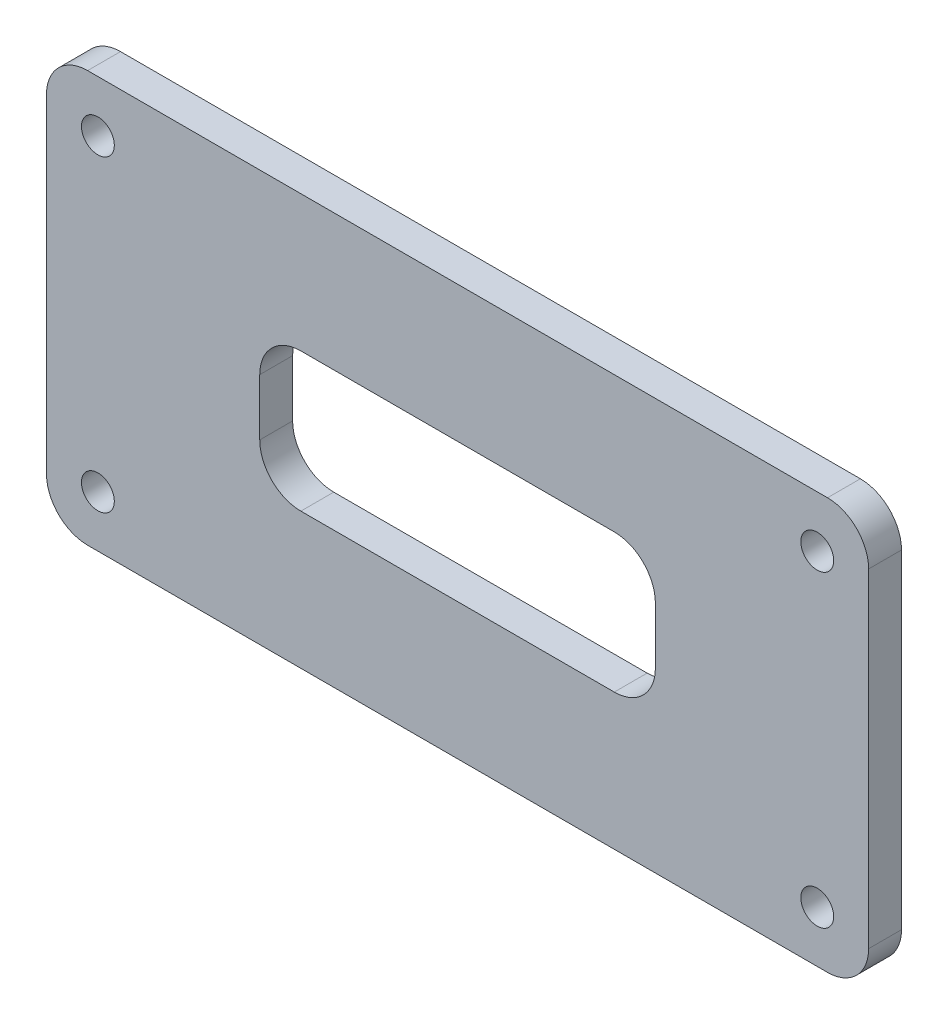
ISO-10303-21;
HEADER;
FILE_DESCRIPTION(('STEP AP214'),'2;1');
FILE_NAME('part.step','',(''),(''),'','','');
FILE_SCHEMA(('AUTOMOTIVE_DESIGN { 1 0 10303 214 1 1 1 1 }'));
ENDSEC;
DATA;
#1=APPLICATION_CONTEXT('core data for automotive mechanical design processes');
#2=APPLICATION_PROTOCOL_DEFINITION('international standard','automotive_design',2000,#1);
#3=PRODUCT_CONTEXT('',#1,'mechanical');
#4=PRODUCT('Part','Part','',(#3));
#5=PRODUCT_RELATED_PRODUCT_CATEGORY('part','',(#4));
#6=PRODUCT_DEFINITION_FORMATION('','',#4);
#7=PRODUCT_DEFINITION_CONTEXT('part definition',#1,'design');
#8=PRODUCT_DEFINITION('design','',#6,#7);
#9=PRODUCT_DEFINITION_SHAPE('','',#8);
#10=(LENGTH_UNIT() NAMED_UNIT(*) SI_UNIT(.MILLI.,.METRE.));
#11=(NAMED_UNIT(*) PLANE_ANGLE_UNIT() SI_UNIT($,.RADIAN.));
#12=(NAMED_UNIT(*) SI_UNIT($,.STERADIAN.) SOLID_ANGLE_UNIT());
#13=UNCERTAINTY_MEASURE_WITH_UNIT(LENGTH_MEASURE(1.E-05),#10,'distance_accuracy_value','');
#14=(GEOMETRIC_REPRESENTATION_CONTEXT(3) GLOBAL_UNCERTAINTY_ASSIGNED_CONTEXT((#13)) GLOBAL_UNIT_ASSIGNED_CONTEXT((#10,
#11,#12)) REPRESENTATION_CONTEXT('',''));
#15=CARTESIAN_POINT('',(0.,0.,0.));
#16=DIRECTION('',(0.,0.,1.));
#17=DIRECTION('',(1.,0.,0.));
#18=AXIS2_PLACEMENT_3D('',#15,#16,#17);
#19=CARTESIAN_POINT('',(-36.,-16.,-3.2));
#20=DIRECTION('',(0.,0.,1.));
#21=DIRECTION('',(1.,0.,0.));
#22=AXIS2_PLACEMENT_3D('',#19,#20,#21);
#23=CYLINDRICAL_SURFACE('',#22,4.);
#24=CARTESIAN_POINT('',(-36.,-16.,0.));
#25=DIRECTION('',(0.,0.,1.));
#26=DIRECTION('',(1.,0.,0.));
#27=AXIS2_PLACEMENT_3D('',#24,#25,#26);
#28=CIRCLE('',#27,4.);
#29=CARTESIAN_POINT('',(-40.,-16.,0.));
#30=VERTEX_POINT('',#29);
#31=CARTESIAN_POINT('',(-36.,-20.,0.));
#32=VERTEX_POINT('',#31);
#33=EDGE_CURVE('E229',#30,#32,#28,.T.);
#34=ORIENTED_EDGE('',*,*,#33,.F.);
#35=DIRECTION('',(0.,0.,1.));
#36=VECTOR('',#35,1.);
#37=CARTESIAN_POINT('',(-40.,-16.,-3.2));
#38=LINE('',#37,#36);
#39=CARTESIAN_POINT('',(-40.,-16.,-3.2));
#40=VERTEX_POINT('',#39);
#41=EDGE_CURVE('E12',#40,#30,#38,.T.);
#42=ORIENTED_EDGE('',*,*,#41,.F.);
#43=CARTESIAN_POINT('',(-36.,-16.,-3.2));
#44=DIRECTION('',(0.,0.,1.));
#45=DIRECTION('',(1.,0.,0.));
#46=AXIS2_PLACEMENT_3D('',#43,#44,#45);
#47=CIRCLE('',#46,4.);
#48=CARTESIAN_POINT('',(-36.,-20.,-3.2));
#49=VERTEX_POINT('',#48);
#50=EDGE_CURVE('E241',#40,#49,#47,.T.);
#51=ORIENTED_EDGE('',*,*,#50,.T.);
#52=DIRECTION('',(0.,0.,1.));
#53=VECTOR('',#52,1.);
#54=CARTESIAN_POINT('',(-36.,-20.,-3.2));
#55=LINE('',#54,#53);
#56=EDGE_CURVE('E50',#49,#32,#55,.T.);
#57=ORIENTED_EDGE('',*,*,#56,.T.);
#58=EDGE_LOOP('',(#34,#42,#51,#57));
#59=FACE_BOUND('',#58,.T.);
#60=ADVANCED_FACE('F47',(#59),#23,.T.);
#61=CARTESIAN_POINT('',(-40.,16.,-3.2));
#62=DIRECTION('',(-1.,0.,0.));
#63=DIRECTION('',(0.,-1.,0.));
#64=AXIS2_PLACEMENT_3D('',#61,#62,#63);
#65=PLANE('',#64);
#66=DIRECTION('',(0.,-1.,0.));
#67=VECTOR('',#66,1.);
#68=CARTESIAN_POINT('',(-40.,16.,0.));
#69=LINE('',#68,#67);
#70=CARTESIAN_POINT('',(-40.,16.,0.));
#71=VERTEX_POINT('',#70);
#72=EDGE_CURVE('E245',#71,#30,#69,.T.);
#73=ORIENTED_EDGE('',*,*,#72,.F.);
#74=DIRECTION('',(0.,0.,1.));
#75=VECTOR('',#74,1.);
#76=CARTESIAN_POINT('',(-40.,16.,-3.2));
#77=LINE('',#76,#75);
#78=CARTESIAN_POINT('',(-40.,16.,-3.2));
#79=VERTEX_POINT('',#78);
#80=EDGE_CURVE('E55',#79,#71,#77,.T.);
#81=ORIENTED_EDGE('',*,*,#80,.F.);
#82=DIRECTION('',(0.,-1.,0.));
#83=VECTOR('',#82,1.);
#84=CARTESIAN_POINT('',(-40.,16.,-3.2));
#85=LINE('',#84,#83);
#86=EDGE_CURVE('E263',#79,#40,#85,.T.);
#87=ORIENTED_EDGE('',*,*,#86,.T.);
#88=ORIENTED_EDGE('',*,*,#41,.T.);
#89=EDGE_LOOP('',(#73,#81,#87,#88));
#90=FACE_BOUND('',#89,.T.);
#91=ADVANCED_FACE('F332',(#90),#65,.T.);
#92=CARTESIAN_POINT('',(-36.,16.,-3.2));
#93=DIRECTION('',(0.,0.,1.));
#94=DIRECTION('',(1.,0.,0.));
#95=AXIS2_PLACEMENT_3D('',#92,#93,#94);
#96=CYLINDRICAL_SURFACE('',#95,4.);
#97=CARTESIAN_POINT('',(-36.,16.,0.));
#98=DIRECTION('',(0.,0.,1.));
#99=DIRECTION('',(1.,0.,0.));
#100=AXIS2_PLACEMENT_3D('',#97,#98,#99);
#101=CIRCLE('',#100,4.);
#102=CARTESIAN_POINT('',(-36.,20.,0.));
#103=VERTEX_POINT('',#102);
#104=EDGE_CURVE('E299',#103,#71,#101,.T.);
#105=ORIENTED_EDGE('',*,*,#104,.F.);
#106=DIRECTION('',(0.,0.,1.));
#107=VECTOR('',#106,1.);
#108=CARTESIAN_POINT('',(-36.,20.,-3.2));
#109=LINE('',#108,#107);
#110=CARTESIAN_POINT('',(-36.,20.,-3.2));
#111=VERTEX_POINT('',#110);
#112=EDGE_CURVE('E308',#111,#103,#109,.T.);
#113=ORIENTED_EDGE('',*,*,#112,.F.);
#114=CARTESIAN_POINT('',(-36.,16.,-3.2));
#115=DIRECTION('',(0.,0.,1.));
#116=DIRECTION('',(1.,0.,0.));
#117=AXIS2_PLACEMENT_3D('',#114,#115,#116);
#118=CIRCLE('',#117,4.);
#119=EDGE_CURVE('E260',#111,#79,#118,.T.);
#120=ORIENTED_EDGE('',*,*,#119,.T.);
#121=ORIENTED_EDGE('',*,*,#80,.T.);
#122=EDGE_LOOP('',(#105,#113,#120,#121));
#123=FACE_BOUND('',#122,.T.);
#124=ADVANCED_FACE('F418',(#123),#96,.T.);
#125=CARTESIAN_POINT('',(-36.,20.,-3.2));
#126=DIRECTION('',(0.,1.,0.));
#127=DIRECTION('',(-1.,0.,0.));
#128=AXIS2_PLACEMENT_3D('',#125,#126,#127);
#129=PLANE('',#128);
#130=DIRECTION('',(-1.,0.,0.));
#131=VECTOR('',#130,1.);
#132=CARTESIAN_POINT('',(-36.,20.,0.));
#133=LINE('',#132,#131);
#134=CARTESIAN_POINT('',(36.,20.,0.));
#135=VERTEX_POINT('',#134);
#136=EDGE_CURVE('E295',#135,#103,#133,.T.);
#137=ORIENTED_EDGE('',*,*,#136,.F.);
#138=DIRECTION('',(0.,0.,1.));
#139=VECTOR('',#138,1.);
#140=CARTESIAN_POINT('',(36.,20.,-3.2));
#141=LINE('',#140,#139);
#142=CARTESIAN_POINT('',(36.,20.,-3.2));
#143=VERTEX_POINT('',#142);
#144=EDGE_CURVE('E310',#143,#135,#141,.T.);
#145=ORIENTED_EDGE('',*,*,#144,.F.);
#146=DIRECTION('',(-1.,0.,0.));
#147=VECTOR('',#146,1.);
#148=CARTESIAN_POINT('',(-36.,20.,-3.2));
#149=LINE('',#148,#147);
#150=EDGE_CURVE('E257',#143,#111,#149,.T.);
#151=ORIENTED_EDGE('',*,*,#150,.T.);
#152=ORIENTED_EDGE('',*,*,#112,.T.);
#153=EDGE_LOOP('',(#137,#145,#151,#152));
#154=FACE_BOUND('',#153,.T.);
#155=ADVANCED_FACE('F349',(#154),#129,.T.);
#156=CARTESIAN_POINT('',(36.,16.,-3.2));
#157=DIRECTION('',(0.,0.,1.));
#158=DIRECTION('',(1.,0.,0.));
#159=AXIS2_PLACEMENT_3D('',#156,#157,#158);
#160=CYLINDRICAL_SURFACE('',#159,4.);
#161=CARTESIAN_POINT('',(36.,16.,0.));
#162=DIRECTION('',(0.,0.,1.));
#163=DIRECTION('',(1.,0.,0.));
#164=AXIS2_PLACEMENT_3D('',#161,#162,#163);
#165=CIRCLE('',#164,4.);
#166=CARTESIAN_POINT('',(40.,16.,0.));
#167=VERTEX_POINT('',#166);
#168=EDGE_CURVE('E290',#167,#135,#165,.T.);
#169=ORIENTED_EDGE('',*,*,#168,.F.);
#170=DIRECTION('',(0.,0.,1.));
#171=VECTOR('',#170,1.);
#172=CARTESIAN_POINT('',(40.,16.,-3.2));
#173=LINE('',#172,#171);
#174=CARTESIAN_POINT('',(40.,16.,-3.2));
#175=VERTEX_POINT('',#174);
#176=EDGE_CURVE('E312',#175,#167,#173,.T.);
#177=ORIENTED_EDGE('',*,*,#176,.F.);
#178=CARTESIAN_POINT('',(36.,16.,-3.2));
#179=DIRECTION('',(0.,0.,1.));
#180=DIRECTION('',(1.,0.,0.));
#181=AXIS2_PLACEMENT_3D('',#178,#179,#180);
#182=CIRCLE('',#181,4.);
#183=EDGE_CURVE('E254',#175,#143,#182,.T.);
#184=ORIENTED_EDGE('',*,*,#183,.T.);
#185=ORIENTED_EDGE('',*,*,#144,.T.);
#186=EDGE_LOOP('',(#169,#177,#184,#185));
#187=FACE_BOUND('',#186,.T.);
#188=ADVANCED_FACE('F345',(#187),#160,.T.);
#189=CARTESIAN_POINT('',(40.,16.,-3.2));
#190=DIRECTION('',(1.,0.,0.));
#191=DIRECTION('',(0.,1.,0.));
#192=AXIS2_PLACEMENT_3D('',#189,#190,#191);
#193=PLANE('',#192);
#194=DIRECTION('',(0.,1.,0.));
#195=VECTOR('',#194,1.);
#196=CARTESIAN_POINT('',(40.,16.,0.));
#197=LINE('',#196,#195);
#198=CARTESIAN_POINT('',(40.,-16.,0.));
#199=VERTEX_POINT('',#198);
#200=EDGE_CURVE('E285',#199,#167,#197,.T.);
#201=ORIENTED_EDGE('',*,*,#200,.F.);
#202=DIRECTION('',(0.,0.,1.));
#203=VECTOR('',#202,1.);
#204=CARTESIAN_POINT('',(40.,-16.,-3.2));
#205=LINE('',#204,#203);
#206=CARTESIAN_POINT('',(40.,-16.,-3.2));
#207=VERTEX_POINT('',#206);
#208=EDGE_CURVE('E314',#207,#199,#205,.T.);
#209=ORIENTED_EDGE('',*,*,#208,.F.);
#210=DIRECTION('',(0.,1.,0.));
#211=VECTOR('',#210,1.);
#212=CARTESIAN_POINT('',(40.,16.,-3.2));
#213=LINE('',#212,#211);
#214=EDGE_CURVE('E251',#207,#175,#213,.T.);
#215=ORIENTED_EDGE('',*,*,#214,.T.);
#216=ORIENTED_EDGE('',*,*,#176,.T.);
#217=EDGE_LOOP('',(#201,#209,#215,#216));
#218=FACE_BOUND('',#217,.T.);
#219=ADVANCED_FACE('F343',(#218),#193,.T.);
#220=CARTESIAN_POINT('',(36.,-16.,-3.2));
#221=DIRECTION('',(0.,0.,1.));
#222=DIRECTION('',(1.,0.,0.));
#223=AXIS2_PLACEMENT_3D('',#220,#221,#222);
#224=CYLINDRICAL_SURFACE('',#223,4.);
#225=CARTESIAN_POINT('',(36.,-16.,0.));
#226=DIRECTION('',(0.,0.,1.));
#227=DIRECTION('',(1.,0.,0.));
#228=AXIS2_PLACEMENT_3D('',#225,#226,#227);
#229=CIRCLE('',#228,4.);
#230=CARTESIAN_POINT('',(36.,-20.,0.));
#231=VERTEX_POINT('',#230);
#232=EDGE_CURVE('E281',#231,#199,#229,.T.);
#233=ORIENTED_EDGE('',*,*,#232,.F.);
#234=DIRECTION('',(0.,0.,1.));
#235=VECTOR('',#234,1.);
#236=CARTESIAN_POINT('',(36.,-20.,-3.2));
#237=LINE('',#236,#235);
#238=CARTESIAN_POINT('',(36.,-20.,-3.2));
#239=VERTEX_POINT('',#238);
#240=EDGE_CURVE('E315',#239,#231,#237,.T.);
#241=ORIENTED_EDGE('',*,*,#240,.F.);
#242=CARTESIAN_POINT('',(36.,-16.,-3.2));
#243=DIRECTION('',(0.,0.,1.));
#244=DIRECTION('',(1.,0.,0.));
#245=AXIS2_PLACEMENT_3D('',#242,#243,#244);
#246=CIRCLE('',#245,4.);
#247=EDGE_CURVE('E248',#239,#207,#246,.T.);
#248=ORIENTED_EDGE('',*,*,#247,.T.);
#249=ORIENTED_EDGE('',*,*,#208,.T.);
#250=EDGE_LOOP('',(#233,#241,#248,#249));
#251=FACE_BOUND('',#250,.T.);
#252=ADVANCED_FACE('F339',(#251),#224,.T.);
#253=CARTESIAN_POINT('',(-36.,-20.,-3.2));
#254=DIRECTION('',(0.,-1.,0.));
#255=DIRECTION('',(0.,0.,-1.));
#256=AXIS2_PLACEMENT_3D('',#253,#254,#255);
#257=PLANE('',#256);
#258=DIRECTION('',(1.,0.,0.));
#259=VECTOR('',#258,1.);
#260=CARTESIAN_POINT('',(-36.,-20.,0.));
#261=LINE('',#260,#259);
#262=EDGE_CURVE('E270',#32,#231,#261,.T.);
#263=ORIENTED_EDGE('',*,*,#262,.F.);
#264=ORIENTED_EDGE('',*,*,#56,.F.);
#265=DIRECTION('',(1.,0.,0.));
#266=VECTOR('',#265,1.);
#267=CARTESIAN_POINT('',(-36.,-20.,-3.2));
#268=LINE('',#267,#266);
#269=EDGE_CURVE('E244',#49,#239,#268,.T.);
#270=ORIENTED_EDGE('',*,*,#269,.T.);
#271=ORIENTED_EDGE('',*,*,#240,.T.);
#272=EDGE_LOOP('',(#263,#264,#270,#271));
#273=FACE_BOUND('',#272,.T.);
#274=ADVANCED_FACE('F324',(#273),#257,.T.);
#275=CARTESIAN_POINT('',(-36.,-16.,-3.2));
#276=DIRECTION('',(0.,0.,1.));
#277=DIRECTION('',(1.,0.,0.));
#278=AXIS2_PLACEMENT_3D('',#275,#276,#277);
#279=PLANE('',#278);
#280=CARTESIAN_POINT('',(-35.,-15.,-3.2));
#281=DIRECTION('',(0.,0.,1.));
#282=DIRECTION('',(1.,0.,0.));
#283=AXIS2_PLACEMENT_3D('',#280,#281,#282);
#284=CIRCLE('',#283,1.6);
#285=CARTESIAN_POINT('',(-33.4,-15.,-3.2));
#286=VERTEX_POINT('',#285);
#287=EDGE_CURVE('E358',#286,#286,#284,.T.);
#288=ORIENTED_EDGE('',*,*,#287,.T.);
#289=EDGE_LOOP('',(#288));
#290=FACE_BOUND('',#289,.T.);
#291=CARTESIAN_POINT('',(35.,-15.,-3.2));
#292=DIRECTION('',(0.,0.,1.));
#293=DIRECTION('',(1.,0.,0.));
#294=AXIS2_PLACEMENT_3D('',#291,#292,#293);
#295=CIRCLE('',#294,1.6);
#296=CARTESIAN_POINT('',(36.6,-15.,-3.2));
#297=VERTEX_POINT('',#296);
#298=EDGE_CURVE('E357',#297,#297,#295,.T.);
#299=ORIENTED_EDGE('',*,*,#298,.T.);
#300=EDGE_LOOP('',(#299));
#301=FACE_BOUND('',#300,.T.);
#302=CARTESIAN_POINT('',(35.,15.,-3.2));
#303=DIRECTION('',(0.,0.,1.));
#304=DIRECTION('',(1.,0.,0.));
#305=AXIS2_PLACEMENT_3D('',#302,#303,#304);
#306=CIRCLE('',#305,1.6);
#307=CARTESIAN_POINT('',(36.6,15.,-3.2));
#308=VERTEX_POINT('',#307);
#309=EDGE_CURVE('E362',#308,#308,#306,.T.);
#310=ORIENTED_EDGE('',*,*,#309,.T.);
#311=EDGE_LOOP('',(#310));
#312=FACE_BOUND('',#311,.T.);
#313=CARTESIAN_POINT('',(-35.,15.,-3.2));
#314=DIRECTION('',(0.,0.,1.));
#315=DIRECTION('',(1.,0.,0.));
#316=AXIS2_PLACEMENT_3D('',#313,#314,#315);
#317=CIRCLE('',#316,1.6);
#318=CARTESIAN_POINT('',(-33.4,15.,-3.2));
#319=VERTEX_POINT('',#318);
#320=EDGE_CURVE('E205',#319,#319,#317,.T.);
#321=ORIENTED_EDGE('',*,*,#320,.T.);
#322=EDGE_LOOP('',(#321));
#323=FACE_BOUND('',#322,.T.);
#324=DIRECTION('',(0.,-1.,0.));
#325=VECTOR('',#324,1.);
#326=CARTESIAN_POINT('',(-19.25,2.75,-3.2));
#327=LINE('',#326,#325);
#328=CARTESIAN_POINT('',(-19.25,2.75,-3.2));
#329=VERTEX_POINT('',#328);
#330=CARTESIAN_POINT('',(-19.25,-2.75,-3.2));
#331=VERTEX_POINT('',#330);
#332=EDGE_CURVE('E168',#329,#331,#327,.T.);
#333=ORIENTED_EDGE('',*,*,#332,.T.);
#334=CARTESIAN_POINT('',(-15.25,-2.75,-3.2));
#335=DIRECTION('',(0.,0.,1.));
#336=DIRECTION('',(1.,0.,0.));
#337=AXIS2_PLACEMENT_3D('',#334,#335,#336);
#338=CIRCLE('',#337,4.);
#339=CARTESIAN_POINT('',(-15.25,-6.75,-3.2));
#340=VERTEX_POINT('',#339);
#341=EDGE_CURVE('E162',#331,#340,#338,.T.);
#342=ORIENTED_EDGE('',*,*,#341,.T.);
#343=DIRECTION('',(1.,0.,0.));
#344=VECTOR('',#343,1.);
#345=CARTESIAN_POINT('',(-15.25,-6.75,-3.2));
#346=LINE('',#345,#344);
#347=CARTESIAN_POINT('',(15.25,-6.75,-3.2));
#348=VERTEX_POINT('',#347);
#349=EDGE_CURVE('E171',#340,#348,#346,.T.);
#350=ORIENTED_EDGE('',*,*,#349,.T.);
#351=CARTESIAN_POINT('',(15.25,-2.75,-3.2));
#352=DIRECTION('',(0.,0.,1.));
#353=DIRECTION('',(1.,0.,0.));
#354=AXIS2_PLACEMENT_3D('',#351,#352,#353);
#355=CIRCLE('',#354,4.);
#356=CARTESIAN_POINT('',(19.25,-2.75,-3.2));
#357=VERTEX_POINT('',#356);
#358=EDGE_CURVE('E63',#348,#357,#355,.T.);
#359=ORIENTED_EDGE('',*,*,#358,.T.);
#360=DIRECTION('',(0.,1.,0.));
#361=VECTOR('',#360,1.);
#362=CARTESIAN_POINT('',(19.25,2.75,-3.2));
#363=LINE('',#362,#361);
#364=CARTESIAN_POINT('',(19.25,2.75,-3.2));
#365=VERTEX_POINT('',#364);
#366=EDGE_CURVE('E190',#357,#365,#363,.T.);
#367=ORIENTED_EDGE('',*,*,#366,.T.);
#368=CARTESIAN_POINT('',(15.25,2.75,-3.2));
#369=DIRECTION('',(0.,0.,1.));
#370=DIRECTION('',(1.,0.,0.));
#371=AXIS2_PLACEMENT_3D('',#368,#369,#370);
#372=CIRCLE('',#371,4.);
#373=CARTESIAN_POINT('',(15.25,6.75,-3.2));
#374=VERTEX_POINT('',#373);
#375=EDGE_CURVE('E193',#365,#374,#372,.T.);
#376=ORIENTED_EDGE('',*,*,#375,.T.);
#377=DIRECTION('',(-1.,0.,0.));
#378=VECTOR('',#377,1.);
#379=CARTESIAN_POINT('',(-15.25,6.75,-3.2));
#380=LINE('',#379,#378);
#381=CARTESIAN_POINT('',(-15.25,6.75,-3.2));
#382=VERTEX_POINT('',#381);
#383=EDGE_CURVE('E196',#374,#382,#380,.T.);
#384=ORIENTED_EDGE('',*,*,#383,.T.);
#385=CARTESIAN_POINT('',(-15.25,2.75,-3.2));
#386=DIRECTION('',(0.,0.,1.));
#387=DIRECTION('',(1.,0.,0.));
#388=AXIS2_PLACEMENT_3D('',#385,#386,#387);
#389=CIRCLE('',#388,4.);
#390=EDGE_CURVE('E199',#382,#329,#389,.T.);
#391=ORIENTED_EDGE('',*,*,#390,.T.);
#392=EDGE_LOOP('',(#333,#342,#350,#359,#367,#376,#384,#391));
#393=FACE_BOUND('',#392,.T.);
#394=ORIENTED_EDGE('',*,*,#50,.F.);
#395=ORIENTED_EDGE('',*,*,#86,.F.);
#396=ORIENTED_EDGE('',*,*,#119,.F.);
#397=ORIENTED_EDGE('',*,*,#150,.F.);
#398=ORIENTED_EDGE('',*,*,#183,.F.);
#399=ORIENTED_EDGE('',*,*,#214,.F.);
#400=ORIENTED_EDGE('',*,*,#247,.F.);
#401=ORIENTED_EDGE('',*,*,#269,.F.);
#402=EDGE_LOOP('',(#394,#395,#396,#397,#398,#399,#400,#401));
#403=FACE_BOUND('',#402,.T.);
#404=ADVANCED_FACE('F175',(#290,#301,#312,#323,#393,#403),#279,.F.);
#405=CARTESIAN_POINT('',(-36.,-16.,0.));
#406=DIRECTION('',(0.,0.,1.));
#407=DIRECTION('',(1.,0.,0.));
#408=AXIS2_PLACEMENT_3D('',#405,#406,#407);
#409=PLANE('',#408);
#410=CARTESIAN_POINT('',(-35.,-15.,0.));
#411=DIRECTION('',(0.,0.,1.));
#412=DIRECTION('',(1.,0.,0.));
#413=AXIS2_PLACEMENT_3D('',#410,#411,#412);
#414=CIRCLE('',#413,1.6);
#415=CARTESIAN_POINT('',(-33.4,-15.,0.));
#416=VERTEX_POINT('',#415);
#417=EDGE_CURVE('E363',#416,#416,#414,.T.);
#418=ORIENTED_EDGE('',*,*,#417,.F.);
#419=EDGE_LOOP('',(#418));
#420=FACE_BOUND('',#419,.T.);
#421=CARTESIAN_POINT('',(35.,-15.,0.));
#422=DIRECTION('',(0.,0.,1.));
#423=DIRECTION('',(1.,0.,0.));
#424=AXIS2_PLACEMENT_3D('',#421,#422,#423);
#425=CIRCLE('',#424,1.6);
#426=CARTESIAN_POINT('',(36.6,-15.,0.));
#427=VERTEX_POINT('',#426);
#428=EDGE_CURVE('E354',#427,#427,#425,.T.);
#429=ORIENTED_EDGE('',*,*,#428,.F.);
#430=EDGE_LOOP('',(#429));
#431=FACE_BOUND('',#430,.T.);
#432=CARTESIAN_POINT('',(35.,15.,0.));
#433=DIRECTION('',(0.,0.,1.));
#434=DIRECTION('',(1.,0.,0.));
#435=AXIS2_PLACEMENT_3D('',#432,#433,#434);
#436=CIRCLE('',#435,1.6);
#437=CARTESIAN_POINT('',(36.6,15.,0.));
#438=VERTEX_POINT('',#437);
#439=EDGE_CURVE('E352',#438,#438,#436,.T.);
#440=ORIENTED_EDGE('',*,*,#439,.F.);
#441=EDGE_LOOP('',(#440));
#442=FACE_BOUND('',#441,.T.);
#443=CARTESIAN_POINT('',(-35.,15.,0.));
#444=DIRECTION('',(0.,0.,1.));
#445=DIRECTION('',(1.,0.,0.));
#446=AXIS2_PLACEMENT_3D('',#443,#444,#445);
#447=CIRCLE('',#446,1.6);
#448=CARTESIAN_POINT('',(-33.4,15.,0.));
#449=VERTEX_POINT('',#448);
#450=EDGE_CURVE('E186',#449,#449,#447,.T.);
#451=ORIENTED_EDGE('',*,*,#450,.F.);
#452=EDGE_LOOP('',(#451));
#453=FACE_BOUND('',#452,.T.);
#454=CARTESIAN_POINT('',(-15.25,-2.75,0.));
#455=DIRECTION('',(0.,0.,1.));
#456=DIRECTION('',(1.,0.,0.));
#457=AXIS2_PLACEMENT_3D('',#454,#455,#456);
#458=CIRCLE('',#457,4.);
#459=CARTESIAN_POINT('',(-19.25,-2.75,0.));
#460=VERTEX_POINT('',#459);
#461=CARTESIAN_POINT('',(-15.25,-6.75,0.));
#462=VERTEX_POINT('',#461);
#463=EDGE_CURVE('E71',#460,#462,#458,.T.);
#464=ORIENTED_EDGE('',*,*,#463,.F.);
#465=DIRECTION('',(0.,-1.,0.));
#466=VECTOR('',#465,1.);
#467=CARTESIAN_POINT('',(-19.25,2.75,0.));
#468=LINE('',#467,#466);
#469=CARTESIAN_POINT('',(-19.25,2.75,0.));
#470=VERTEX_POINT('',#469);
#471=EDGE_CURVE('E179',#470,#460,#468,.T.);
#472=ORIENTED_EDGE('',*,*,#471,.F.);
#473=CARTESIAN_POINT('',(-15.25,2.75,0.));
#474=DIRECTION('',(0.,0.,1.));
#475=DIRECTION('',(1.,0.,0.));
#476=AXIS2_PLACEMENT_3D('',#473,#474,#475);
#477=CIRCLE('',#476,4.);
#478=CARTESIAN_POINT('',(-15.25,6.75,0.));
#479=VERTEX_POINT('',#478);
#480=EDGE_CURVE('E183',#479,#470,#477,.T.);
#481=ORIENTED_EDGE('',*,*,#480,.F.);
#482=DIRECTION('',(-1.,0.,0.));
#483=VECTOR('',#482,1.);
#484=CARTESIAN_POINT('',(-15.25,6.75,0.));
#485=LINE('',#484,#483);
#486=CARTESIAN_POINT('',(15.25,6.75,0.));
#487=VERTEX_POINT('',#486);
#488=EDGE_CURVE('E220',#487,#479,#485,.T.);
#489=ORIENTED_EDGE('',*,*,#488,.F.);
#490=CARTESIAN_POINT('',(15.25,2.75,0.));
#491=DIRECTION('',(0.,0.,1.));
#492=DIRECTION('',(1.,0.,0.));
#493=AXIS2_PLACEMENT_3D('',#490,#491,#492);
#494=CIRCLE('',#493,4.);
#495=CARTESIAN_POINT('',(19.25,2.75,0.));
#496=VERTEX_POINT('',#495);
#497=EDGE_CURVE('E216',#496,#487,#494,.T.);
#498=ORIENTED_EDGE('',*,*,#497,.F.);
#499=DIRECTION('',(0.,1.,0.));
#500=VECTOR('',#499,1.);
#501=CARTESIAN_POINT('',(19.25,2.75,0.));
#502=LINE('',#501,#500);
#503=CARTESIAN_POINT('',(19.25,-2.75,0.));
#504=VERTEX_POINT('',#503);
#505=EDGE_CURVE('E212',#504,#496,#502,.T.);
#506=ORIENTED_EDGE('',*,*,#505,.F.);
#507=CARTESIAN_POINT('',(15.25,-2.75,0.));
#508=DIRECTION('',(0.,0.,1.));
#509=DIRECTION('',(1.,0.,0.));
#510=AXIS2_PLACEMENT_3D('',#507,#508,#509);
#511=CIRCLE('',#510,4.);
#512=CARTESIAN_POINT('',(15.25,-6.75,0.));
#513=VERTEX_POINT('',#512);
#514=EDGE_CURVE('E208',#513,#504,#511,.T.);
#515=ORIENTED_EDGE('',*,*,#514,.F.);
#516=DIRECTION('',(1.,0.,0.));
#517=VECTOR('',#516,1.);
#518=CARTESIAN_POINT('',(-15.25,-6.75,0.));
#519=LINE('',#518,#517);
#520=EDGE_CURVE('E204',#462,#513,#519,.T.);
#521=ORIENTED_EDGE('',*,*,#520,.F.);
#522=EDGE_LOOP('',(#464,#472,#481,#489,#498,#506,#515,#521));
#523=FACE_BOUND('',#522,.T.);
#524=ORIENTED_EDGE('',*,*,#33,.T.);
#525=ORIENTED_EDGE('',*,*,#262,.T.);
#526=ORIENTED_EDGE('',*,*,#232,.T.);
#527=ORIENTED_EDGE('',*,*,#200,.T.);
#528=ORIENTED_EDGE('',*,*,#168,.T.);
#529=ORIENTED_EDGE('',*,*,#136,.T.);
#530=ORIENTED_EDGE('',*,*,#104,.T.);
#531=ORIENTED_EDGE('',*,*,#72,.T.);
#532=EDGE_LOOP('',(#524,#525,#526,#527,#528,#529,#530,#531));
#533=FACE_BOUND('',#532,.T.);
#534=ADVANCED_FACE('F327',(#420,#431,#442,#453,#523,#533),#409,.T.);
#535=CARTESIAN_POINT('',(-15.25,-2.75,-3.2));
#536=DIRECTION('',(0.,0.,1.));
#537=DIRECTION('',(1.,0.,0.));
#538=AXIS2_PLACEMENT_3D('',#535,#536,#537);
#539=CYLINDRICAL_SURFACE('',#538,4.);
#540=ORIENTED_EDGE('',*,*,#463,.T.);
#541=DIRECTION('',(0.,0.,1.));
#542=VECTOR('',#541,1.);
#543=CARTESIAN_POINT('',(-15.25,-6.75,-3.2));
#544=LINE('',#543,#542);
#545=EDGE_CURVE('E158',#340,#462,#544,.T.);
#546=ORIENTED_EDGE('',*,*,#545,.F.);
#547=ORIENTED_EDGE('',*,*,#341,.F.);
#548=DIRECTION('',(0.,0.,1.));
#549=VECTOR('',#548,1.);
#550=CARTESIAN_POINT('',(-19.25,-2.75,-3.2));
#551=LINE('',#550,#549);
#552=EDGE_CURVE('E227',#331,#460,#551,.T.);
#553=ORIENTED_EDGE('',*,*,#552,.T.);
#554=EDGE_LOOP('',(#540,#546,#547,#553));
#555=FACE_BOUND('',#554,.T.);
#556=ADVANCED_FACE('F160',(#555),#539,.F.);
#557=CARTESIAN_POINT('',(-19.25,2.75,-3.2));
#558=DIRECTION('',(-1.,0.,0.));
#559=DIRECTION('',(0.,0.,1.));
#560=AXIS2_PLACEMENT_3D('',#557,#558,#559);
#561=PLANE('',#560);
#562=ORIENTED_EDGE('',*,*,#471,.T.);
#563=ORIENTED_EDGE('',*,*,#552,.F.);
#564=ORIENTED_EDGE('',*,*,#332,.F.);
#565=DIRECTION('',(0.,0.,1.));
#566=VECTOR('',#565,1.);
#567=CARTESIAN_POINT('',(-19.25,2.75,-3.2));
#568=LINE('',#567,#566);
#569=EDGE_CURVE('E230',#329,#470,#568,.T.);
#570=ORIENTED_EDGE('',*,*,#569,.T.);
#571=EDGE_LOOP('',(#562,#563,#564,#570));
#572=FACE_BOUND('',#571,.T.);
#573=ADVANCED_FACE('F405',(#572),#561,.F.);
#574=CARTESIAN_POINT('',(-15.25,2.75,-3.2));
#575=DIRECTION('',(0.,0.,1.));
#576=DIRECTION('',(1.,0.,0.));
#577=AXIS2_PLACEMENT_3D('',#574,#575,#576);
#578=CYLINDRICAL_SURFACE('',#577,4.);
#579=ORIENTED_EDGE('',*,*,#480,.T.);
#580=ORIENTED_EDGE('',*,*,#569,.F.);
#581=ORIENTED_EDGE('',*,*,#390,.F.);
#582=DIRECTION('',(0.,0.,1.));
#583=VECTOR('',#582,1.);
#584=CARTESIAN_POINT('',(-15.25,6.75,-3.2));
#585=LINE('',#584,#583);
#586=EDGE_CURVE('E232',#382,#479,#585,.T.);
#587=ORIENTED_EDGE('',*,*,#586,.T.);
#588=EDGE_LOOP('',(#579,#580,#581,#587));
#589=FACE_BOUND('',#588,.T.);
#590=ADVANCED_FACE('F403',(#589),#578,.F.);
#591=CARTESIAN_POINT('',(-15.25,6.75,-3.2));
#592=DIRECTION('',(0.,1.,0.));
#593=DIRECTION('',(0.,0.,1.));
#594=AXIS2_PLACEMENT_3D('',#591,#592,#593);
#595=PLANE('',#594);
#596=ORIENTED_EDGE('',*,*,#488,.T.);
#597=ORIENTED_EDGE('',*,*,#586,.F.);
#598=ORIENTED_EDGE('',*,*,#383,.F.);
#599=DIRECTION('',(0.,0.,1.));
#600=VECTOR('',#599,1.);
#601=CARTESIAN_POINT('',(15.25,6.75,-3.2));
#602=LINE('',#601,#600);
#603=EDGE_CURVE('E234',#374,#487,#602,.T.);
#604=ORIENTED_EDGE('',*,*,#603,.T.);
#605=EDGE_LOOP('',(#596,#597,#598,#604));
#606=FACE_BOUND('',#605,.T.);
#607=ADVANCED_FACE('F400',(#606),#595,.F.);
#608=CARTESIAN_POINT('',(15.25,2.75,-3.2));
#609=DIRECTION('',(0.,0.,1.));
#610=DIRECTION('',(1.,0.,0.));
#611=AXIS2_PLACEMENT_3D('',#608,#609,#610);
#612=CYLINDRICAL_SURFACE('',#611,4.);
#613=ORIENTED_EDGE('',*,*,#497,.T.);
#614=ORIENTED_EDGE('',*,*,#603,.F.);
#615=ORIENTED_EDGE('',*,*,#375,.F.);
#616=DIRECTION('',(0.,0.,1.));
#617=VECTOR('',#616,1.);
#618=CARTESIAN_POINT('',(19.25,2.75,-3.2));
#619=LINE('',#618,#617);
#620=EDGE_CURVE('E236',#365,#496,#619,.T.);
#621=ORIENTED_EDGE('',*,*,#620,.T.);
#622=EDGE_LOOP('',(#613,#614,#615,#621));
#623=FACE_BOUND('',#622,.T.);
#624=ADVANCED_FACE('F397',(#623),#612,.F.);
#625=CARTESIAN_POINT('',(19.25,2.75,-3.2));
#626=DIRECTION('',(1.,0.,0.));
#627=DIRECTION('',(0.,0.,-1.));
#628=AXIS2_PLACEMENT_3D('',#625,#626,#627);
#629=PLANE('',#628);
#630=ORIENTED_EDGE('',*,*,#505,.T.);
#631=ORIENTED_EDGE('',*,*,#620,.F.);
#632=ORIENTED_EDGE('',*,*,#366,.F.);
#633=DIRECTION('',(0.,0.,1.));
#634=VECTOR('',#633,1.);
#635=CARTESIAN_POINT('',(19.25,-2.75,-3.2));
#636=LINE('',#635,#634);
#637=EDGE_CURVE('E238',#357,#504,#636,.T.);
#638=ORIENTED_EDGE('',*,*,#637,.T.);
#639=EDGE_LOOP('',(#630,#631,#632,#638));
#640=FACE_BOUND('',#639,.T.);
#641=ADVANCED_FACE('F393',(#640),#629,.F.);
#642=CARTESIAN_POINT('',(15.25,-2.75,-3.2));
#643=DIRECTION('',(0.,0.,1.));
#644=DIRECTION('',(1.,0.,0.));
#645=AXIS2_PLACEMENT_3D('',#642,#643,#644);
#646=CYLINDRICAL_SURFACE('',#645,4.);
#647=ORIENTED_EDGE('',*,*,#514,.T.);
#648=ORIENTED_EDGE('',*,*,#637,.F.);
#649=ORIENTED_EDGE('',*,*,#358,.F.);
#650=DIRECTION('',(0.,0.,1.));
#651=VECTOR('',#650,1.);
#652=CARTESIAN_POINT('',(15.25,-6.75,-3.2));
#653=LINE('',#652,#651);
#654=EDGE_CURVE('E167',#348,#513,#653,.T.);
#655=ORIENTED_EDGE('',*,*,#654,.T.);
#656=EDGE_LOOP('',(#647,#648,#649,#655));
#657=FACE_BOUND('',#656,.T.);
#658=ADVANCED_FACE('F390',(#657),#646,.F.);
#659=CARTESIAN_POINT('',(-15.25,-6.75,-3.2));
#660=DIRECTION('',(0.,-1.,0.));
#661=DIRECTION('',(0.,0.,-1.));
#662=AXIS2_PLACEMENT_3D('',#659,#660,#661);
#663=PLANE('',#662);
#664=ORIENTED_EDGE('',*,*,#520,.T.);
#665=ORIENTED_EDGE('',*,*,#654,.F.);
#666=ORIENTED_EDGE('',*,*,#349,.F.);
#667=ORIENTED_EDGE('',*,*,#545,.T.);
#668=EDGE_LOOP('',(#664,#665,#666,#667));
#669=FACE_BOUND('',#668,.T.);
#670=ADVANCED_FACE('F172',(#669),#663,.F.);
#671=CARTESIAN_POINT('',(-35.,15.,-3.2));
#672=DIRECTION('',(0.,0.,1.));
#673=DIRECTION('',(1.,0.,0.));
#674=AXIS2_PLACEMENT_3D('',#671,#672,#673);
#675=CYLINDRICAL_SURFACE('',#674,1.6);
#676=ORIENTED_EDGE('',*,*,#320,.F.);
#677=EDGE_LOOP('',(#676));
#678=FACE_BOUND('',#677,.T.);
#679=ORIENTED_EDGE('',*,*,#450,.T.);
#680=EDGE_LOOP('',(#679));
#681=FACE_BOUND('',#680,.T.);
#682=ADVANCED_FACE('F374',(#678,#681),#675,.F.);
#683=CARTESIAN_POINT('',(35.,15.,-3.2));
#684=DIRECTION('',(0.,0.,1.));
#685=DIRECTION('',(1.,0.,0.));
#686=AXIS2_PLACEMENT_3D('',#683,#684,#685);
#687=CYLINDRICAL_SURFACE('',#686,1.6);
#688=ORIENTED_EDGE('',*,*,#309,.F.);
#689=EDGE_LOOP('',(#688));
#690=FACE_BOUND('',#689,.T.);
#691=ORIENTED_EDGE('',*,*,#439,.T.);
#692=EDGE_LOOP('',(#691));
#693=FACE_BOUND('',#692,.T.);
#694=ADVANCED_FACE('F377',(#690,#693),#687,.F.);
#695=CARTESIAN_POINT('',(35.,-15.,-3.2));
#696=DIRECTION('',(0.,0.,1.));
#697=DIRECTION('',(1.,0.,0.));
#698=AXIS2_PLACEMENT_3D('',#695,#696,#697);
#699=CYLINDRICAL_SURFACE('',#698,1.6);
#700=ORIENTED_EDGE('',*,*,#298,.F.);
#701=EDGE_LOOP('',(#700));
#702=FACE_BOUND('',#701,.T.);
#703=ORIENTED_EDGE('',*,*,#428,.T.);
#704=EDGE_LOOP('',(#703));
#705=FACE_BOUND('',#704,.T.);
#706=ADVANCED_FACE('F485',(#702,#705),#699,.F.);
#707=CARTESIAN_POINT('',(-35.,-15.,-3.2));
#708=DIRECTION('',(0.,0.,1.));
#709=DIRECTION('',(1.,0.,0.));
#710=AXIS2_PLACEMENT_3D('',#707,#708,#709);
#711=CYLINDRICAL_SURFACE('',#710,1.6);
#712=ORIENTED_EDGE('',*,*,#287,.F.);
#713=EDGE_LOOP('',(#712));
#714=FACE_BOUND('',#713,.T.);
#715=ORIENTED_EDGE('',*,*,#417,.T.);
#716=EDGE_LOOP('',(#715));
#717=FACE_BOUND('',#716,.T.);
#718=ADVANCED_FACE('F493',(#714,#717),#711,.F.);
#719=CLOSED_SHELL('',(#60,#91,#124,#155,#188,#219,#252,#274,#404,#534,#556,#573,#590,#607,#624,
#641,#658,#670,#682,#694,#706,#718));
#720=MANIFOLD_SOLID_BREP('B2',#719);
#721=ADVANCED_BREP_SHAPE_REPRESENTATION('',(#18,#720),#14);
#722=SHAPE_DEFINITION_REPRESENTATION(#9,#721);
ENDSEC;
END-ISO-10303-21;
